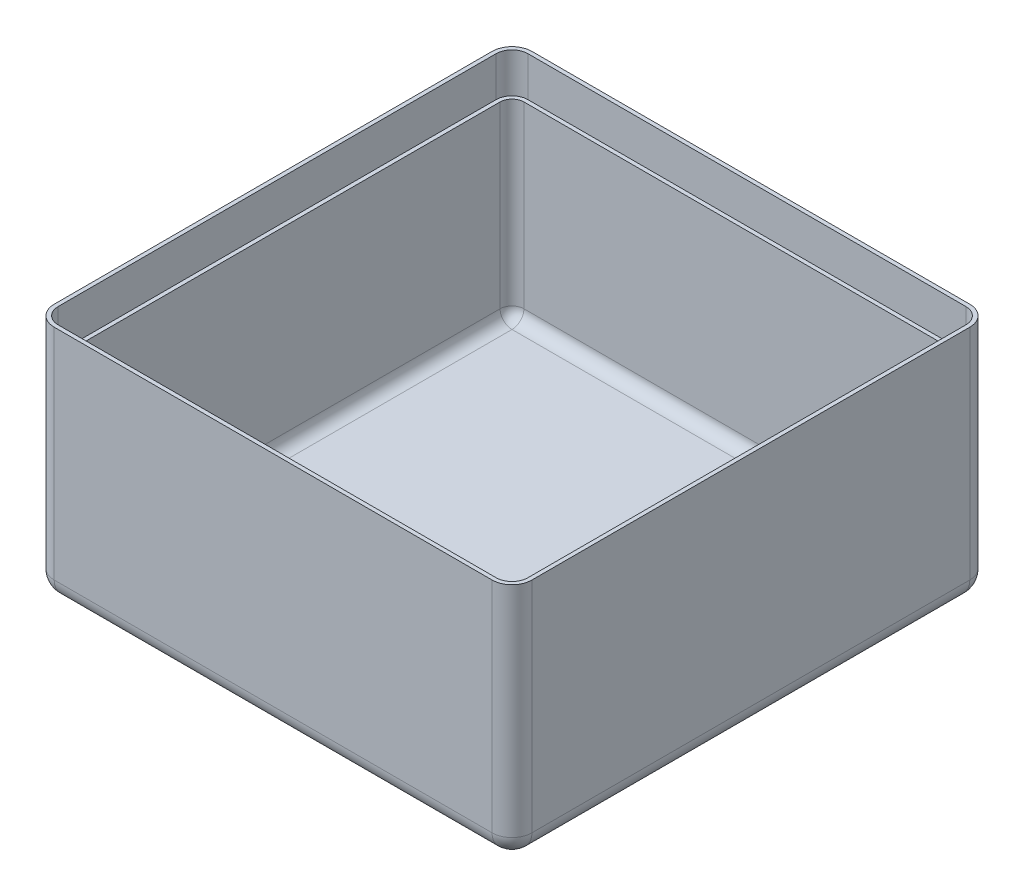
ISO-10303-21;
HEADER;
FILE_DESCRIPTION(('STEP AP214'),'2;1');
FILE_NAME('part.step','',(''),(''),'','','');
FILE_SCHEMA(('AUTOMOTIVE_DESIGN { 1 0 10303 214 1 1 1 1 }'));
ENDSEC;
DATA;
#1=APPLICATION_CONTEXT('core data for automotive mechanical design processes');
#2=APPLICATION_PROTOCOL_DEFINITION('international standard','automotive_design',2000,#1);
#3=PRODUCT_CONTEXT('',#1,'mechanical');
#4=PRODUCT('Part','Part','',(#3));
#5=PRODUCT_RELATED_PRODUCT_CATEGORY('part','',(#4));
#6=PRODUCT_DEFINITION_FORMATION('','',#4);
#7=PRODUCT_DEFINITION_CONTEXT('part definition',#1,'design');
#8=PRODUCT_DEFINITION('design','',#6,#7);
#9=PRODUCT_DEFINITION_SHAPE('','',#8);
#10=(LENGTH_UNIT() NAMED_UNIT(*) SI_UNIT(.MILLI.,.METRE.));
#11=(NAMED_UNIT(*) PLANE_ANGLE_UNIT() SI_UNIT($,.RADIAN.));
#12=(NAMED_UNIT(*) SI_UNIT($,.STERADIAN.) SOLID_ANGLE_UNIT());
#13=UNCERTAINTY_MEASURE_WITH_UNIT(LENGTH_MEASURE(1.E-05),#10,'distance_accuracy_value','');
#14=(GEOMETRIC_REPRESENTATION_CONTEXT(3) GLOBAL_UNCERTAINTY_ASSIGNED_CONTEXT((#13)) GLOBAL_UNIT_ASSIGNED_CONTEXT((#10,
#11,#12)) REPRESENTATION_CONTEXT('',''));
#15=CARTESIAN_POINT('',(0.,0.,0.));
#16=DIRECTION('',(0.,0.,1.));
#17=DIRECTION('',(1.,0.,0.));
#18=AXIS2_PLACEMENT_3D('',#15,#16,#17);
#19=CARTESIAN_POINT('',(0.,25.,0.));
#20=DIRECTION('',(0.,-1.,0.));
#21=DIRECTION('',(0.,0.,-1.));
#22=AXIS2_PLACEMENT_3D('',#19,#20,#21);
#23=PLANE('',#22);
#24=DIRECTION('',(0.,0.,-1.));
#25=VECTOR('',#24,1.);
#26=CARTESIAN_POINT('',(59.5,25.,-2.5));
#27=LINE('',#26,#25);
#28=CARTESIAN_POINT('',(59.5,25.,-2.5));
#29=VERTEX_POINT('',#28);
#30=CARTESIAN_POINT('',(59.5,25.,-57.5));
#31=VERTEX_POINT('',#30);
#32=EDGE_CURVE('E231',#29,#31,#27,.T.);
#33=ORIENTED_EDGE('',*,*,#32,.T.);
#34=CARTESIAN_POINT('',(57.5,25.,-57.5));
#35=DIRECTION('',(0.,1.,0.));
#36=DIRECTION('',(0.,0.,1.));
#37=AXIS2_PLACEMENT_3D('',#34,#35,#36);
#38=CIRCLE('',#37,2.);
#39=CARTESIAN_POINT('',(57.5,25.,-59.5));
#40=VERTEX_POINT('',#39);
#41=EDGE_CURVE('E259',#31,#40,#38,.T.);
#42=ORIENTED_EDGE('',*,*,#41,.T.);
#43=DIRECTION('',(-1.,0.,0.));
#44=VECTOR('',#43,1.);
#45=CARTESIAN_POINT('',(57.5,25.,-59.5));
#46=LINE('',#45,#44);
#47=CARTESIAN_POINT('',(2.49999999999998,25.,-59.5));
#48=VERTEX_POINT('',#47);
#49=EDGE_CURVE('E237',#40,#48,#46,.T.);
#50=ORIENTED_EDGE('',*,*,#49,.T.);
#51=CARTESIAN_POINT('',(2.49999999999998,25.,-57.5));
#52=DIRECTION('',(0.,1.,0.));
#53=DIRECTION('',(0.,0.,1.));
#54=AXIS2_PLACEMENT_3D('',#51,#52,#53);
#55=CIRCLE('',#54,2.);
#56=CARTESIAN_POINT('',(0.499999999999978,25.,-57.5));
#57=VERTEX_POINT('',#56);
#58=EDGE_CURVE('E262',#48,#57,#55,.T.);
#59=ORIENTED_EDGE('',*,*,#58,.T.);
#60=DIRECTION('',(0.,0.,1.));
#61=VECTOR('',#60,1.);
#62=CARTESIAN_POINT('',(0.499999999999979,25.,-57.5));
#63=LINE('',#62,#61);
#64=CARTESIAN_POINT('',(0.499999999999999,25.,-2.5));
#65=VERTEX_POINT('',#64);
#66=EDGE_CURVE('E265',#57,#65,#63,.T.);
#67=ORIENTED_EDGE('',*,*,#66,.T.);
#68=CARTESIAN_POINT('',(2.5,25.,-2.5));
#69=DIRECTION('',(0.,1.,0.));
#70=DIRECTION('',(0.,0.,1.));
#71=AXIS2_PLACEMENT_3D('',#68,#69,#70);
#72=CIRCLE('',#71,2.);
#73=CARTESIAN_POINT('',(2.5,25.,-0.5));
#74=VERTEX_POINT('',#73);
#75=EDGE_CURVE('E268',#65,#74,#72,.T.);
#76=ORIENTED_EDGE('',*,*,#75,.T.);
#77=DIRECTION('',(1.,0.,0.));
#78=VECTOR('',#77,1.);
#79=CARTESIAN_POINT('',(2.5,25.,-0.5));
#80=LINE('',#79,#78);
#81=CARTESIAN_POINT('',(57.5,25.,-0.5));
#82=VERTEX_POINT('',#81);
#83=EDGE_CURVE('E271',#74,#82,#80,.T.);
#84=ORIENTED_EDGE('',*,*,#83,.T.);
#85=CARTESIAN_POINT('',(57.5,25.,-2.5));
#86=DIRECTION('',(0.,1.,0.));
#87=DIRECTION('',(0.,0.,1.));
#88=AXIS2_PLACEMENT_3D('',#85,#86,#87);
#89=CIRCLE('',#88,2.);
#90=EDGE_CURVE('E274',#82,#29,#89,.T.);
#91=ORIENTED_EDGE('',*,*,#90,.T.);
#92=EDGE_LOOP('',(#33,#42,#50,#59,#67,#76,#84,#91));
#93=FACE_BOUND('',#92,.T.);
#94=DIRECTION('',(-1.,0.,0.));
#95=VECTOR('',#94,1.);
#96=CARTESIAN_POINT('',(0.,25.,-59.));
#97=LINE('',#96,#95);
#98=CARTESIAN_POINT('',(57.5,25.,-59.));
#99=VERTEX_POINT('',#98);
#100=CARTESIAN_POINT('',(2.49999999999998,25.,-59.));
#101=VERTEX_POINT('',#100);
#102=EDGE_CURVE('E373',#99,#101,#97,.T.);
#103=ORIENTED_EDGE('',*,*,#102,.F.);
#104=CARTESIAN_POINT('',(57.5,25.,-57.5));
#105=DIRECTION('',(0.,-1.,0.));
#106=DIRECTION('',(0.,0.,-1.));
#107=AXIS2_PLACEMENT_3D('',#104,#105,#106);
#108=CIRCLE('',#107,1.5);
#109=CARTESIAN_POINT('',(59.,25.,-57.5));
#110=VERTEX_POINT('',#109);
#111=EDGE_CURVE('E393',#110,#99,#108,.F.);
#112=ORIENTED_EDGE('',*,*,#111,.F.);
#113=DIRECTION('',(0.,0.,-1.));
#114=VECTOR('',#113,1.);
#115=CARTESIAN_POINT('',(59.,25.,0.));
#116=LINE('',#115,#114);
#117=CARTESIAN_POINT('',(59.,25.,-2.5));
#118=VERTEX_POINT('',#117);
#119=EDGE_CURVE('E58',#118,#110,#116,.T.);
#120=ORIENTED_EDGE('',*,*,#119,.F.);
#121=CARTESIAN_POINT('',(57.5,25.,-2.5));
#122=DIRECTION('',(0.,-1.,0.));
#123=DIRECTION('',(0.,0.,-1.));
#124=AXIS2_PLACEMENT_3D('',#121,#122,#123);
#125=CIRCLE('',#124,1.5);
#126=CARTESIAN_POINT('',(57.5,25.,-1.));
#127=VERTEX_POINT('',#126);
#128=EDGE_CURVE('E389',#127,#118,#125,.F.);
#129=ORIENTED_EDGE('',*,*,#128,.F.);
#130=DIRECTION('',(1.,0.,0.));
#131=VECTOR('',#130,1.);
#132=CARTESIAN_POINT('',(0.,25.,-1.));
#133=LINE('',#132,#131);
#134=CARTESIAN_POINT('',(2.5,25.,-1.));
#135=VERTEX_POINT('',#134);
#136=EDGE_CURVE('E387',#135,#127,#133,.T.);
#137=ORIENTED_EDGE('',*,*,#136,.F.);
#138=CARTESIAN_POINT('',(2.5,25.,-2.5));
#139=DIRECTION('',(0.,-1.,0.));
#140=DIRECTION('',(0.,0.,-1.));
#141=AXIS2_PLACEMENT_3D('',#138,#139,#140);
#142=CIRCLE('',#141,1.5);
#143=CARTESIAN_POINT('',(0.999999999999999,25.,-2.5));
#144=VERTEX_POINT('',#143);
#145=EDGE_CURVE('E317',#144,#135,#142,.F.);
#146=ORIENTED_EDGE('',*,*,#145,.F.);
#147=DIRECTION('',(0.,0.,1.));
#148=VECTOR('',#147,1.);
#149=CARTESIAN_POINT('',(1.,25.,0.));
#150=LINE('',#149,#148);
#151=CARTESIAN_POINT('',(0.99999999999998,25.,-57.5));
#152=VERTEX_POINT('',#151);
#153=EDGE_CURVE('E361',#152,#144,#150,.T.);
#154=ORIENTED_EDGE('',*,*,#153,.F.);
#155=CARTESIAN_POINT('',(2.49999999999998,25.,-57.5));
#156=DIRECTION('',(0.,-1.,0.));
#157=DIRECTION('',(0.,0.,-1.));
#158=AXIS2_PLACEMENT_3D('',#155,#156,#157);
#159=CIRCLE('',#158,1.5);
#160=EDGE_CURVE('E396',#101,#152,#159,.F.);
#161=ORIENTED_EDGE('',*,*,#160,.F.);
#162=EDGE_LOOP('',(#103,#112,#120,#129,#137,#146,#154,#161));
#163=FACE_BOUND('',#162,.T.);
#164=ADVANCED_FACE('F33',(#93,#163),#23,.F.);
#165=CARTESIAN_POINT('',(1.,25.,0.));
#166=DIRECTION('',(1.,0.,0.));
#167=DIRECTION('',(0.,0.,-1.));
#168=AXIS2_PLACEMENT_3D('',#165,#166,#167);
#169=PLANE('',#168);
#170=ORIENTED_EDGE('',*,*,#153,.T.);
#171=DIRECTION('',(0.,1.,0.));
#172=VECTOR('',#171,1.);
#173=CARTESIAN_POINT('',(0.999999999999999,25.,-2.5));
#174=LINE('',#173,#172);
#175=CARTESIAN_POINT('',(0.999999999999999,2.5,-2.5));
#176=VERTEX_POINT('',#175);
#177=EDGE_CURVE('E320',#176,#144,#174,.T.);
#178=ORIENTED_EDGE('',*,*,#177,.F.);
#179=DIRECTION('',(0.,0.,-1.));
#180=VECTOR('',#179,1.);
#181=CARTESIAN_POINT('',(1.,2.5,0.));
#182=LINE('',#181,#180);
#183=CARTESIAN_POINT('',(0.99999999999998,2.5,-57.5));
#184=VERTEX_POINT('',#183);
#185=EDGE_CURVE('E318',#184,#176,#182,.F.);
#186=ORIENTED_EDGE('',*,*,#185,.F.);
#187=DIRECTION('',(0.,1.,0.));
#188=VECTOR('',#187,1.);
#189=CARTESIAN_POINT('',(0.99999999999998,25.,-57.5));
#190=LINE('',#189,#188);
#191=EDGE_CURVE('E315',#152,#184,#190,.F.);
#192=ORIENTED_EDGE('',*,*,#191,.F.);
#193=EDGE_LOOP('',(#170,#178,#186,#192));
#194=FACE_BOUND('',#193,.T.);
#195=ADVANCED_FACE('F527',(#194),#169,.T.);
#196=CARTESIAN_POINT('',(0.,25.,-1.));
#197=DIRECTION('',(0.,0.,-1.));
#198=DIRECTION('',(-1.,0.,0.));
#199=AXIS2_PLACEMENT_3D('',#196,#197,#198);
#200=PLANE('',#199);
#201=DIRECTION('',(-1.,0.,0.));
#202=VECTOR('',#201,1.);
#203=CARTESIAN_POINT('',(0.,2.5,-1.));
#204=LINE('',#203,#202);
#205=CARTESIAN_POINT('',(2.5,2.5,-1.));
#206=VERTEX_POINT('',#205);
#207=CARTESIAN_POINT('',(57.5,2.5,-1.));
#208=VERTEX_POINT('',#207);
#209=EDGE_CURVE('E372',#206,#208,#204,.F.);
#210=ORIENTED_EDGE('',*,*,#209,.F.);
#211=DIRECTION('',(0.,1.,0.));
#212=VECTOR('',#211,1.);
#213=CARTESIAN_POINT('',(2.5,25.,-1.));
#214=LINE('',#213,#212);
#215=EDGE_CURVE('E370',#135,#206,#214,.F.);
#216=ORIENTED_EDGE('',*,*,#215,.F.);
#217=ORIENTED_EDGE('',*,*,#136,.T.);
#218=DIRECTION('',(0.,1.,0.));
#219=VECTOR('',#218,1.);
#220=CARTESIAN_POINT('',(57.5,25.,-1.));
#221=LINE('',#220,#219);
#222=EDGE_CURVE('E357',#208,#127,#221,.T.);
#223=ORIENTED_EDGE('',*,*,#222,.F.);
#224=EDGE_LOOP('',(#210,#216,#217,#223));
#225=FACE_BOUND('',#224,.T.);
#226=ADVANCED_FACE('F535',(#225),#200,.T.);
#227=CARTESIAN_POINT('',(59.,25.,0.));
#228=DIRECTION('',(-1.,0.,0.));
#229=DIRECTION('',(0.,0.,1.));
#230=AXIS2_PLACEMENT_3D('',#227,#228,#229);
#231=PLANE('',#230);
#232=DIRECTION('',(0.,0.,1.));
#233=VECTOR('',#232,1.);
#234=CARTESIAN_POINT('',(59.,2.5,0.));
#235=LINE('',#234,#233);
#236=CARTESIAN_POINT('',(59.,2.5,-2.5));
#237=VERTEX_POINT('',#236);
#238=CARTESIAN_POINT('',(59.,2.5,-57.5));
#239=VERTEX_POINT('',#238);
#240=EDGE_CURVE('E335',#237,#239,#235,.F.);
#241=ORIENTED_EDGE('',*,*,#240,.F.);
#242=DIRECTION('',(0.,1.,0.));
#243=VECTOR('',#242,1.);
#244=CARTESIAN_POINT('',(59.,25.,-2.5));
#245=LINE('',#244,#243);
#246=EDGE_CURVE('E340',#118,#237,#245,.F.);
#247=ORIENTED_EDGE('',*,*,#246,.F.);
#248=ORIENTED_EDGE('',*,*,#119,.T.);
#249=DIRECTION('',(0.,1.,0.));
#250=VECTOR('',#249,1.);
#251=CARTESIAN_POINT('',(59.,25.,-57.5));
#252=LINE('',#251,#250);
#253=EDGE_CURVE('E333',#239,#110,#252,.T.);
#254=ORIENTED_EDGE('',*,*,#253,.F.);
#255=EDGE_LOOP('',(#241,#247,#248,#254));
#256=FACE_BOUND('',#255,.T.);
#257=ADVANCED_FACE('F619',(#256),#231,.T.);
#258=CARTESIAN_POINT('',(0.,25.,-59.));
#259=DIRECTION('',(0.,0.,1.));
#260=DIRECTION('',(1.,0.,0.));
#261=AXIS2_PLACEMENT_3D('',#258,#259,#260);
#262=PLANE('',#261);
#263=DIRECTION('',(1.,0.,0.));
#264=VECTOR('',#263,1.);
#265=CARTESIAN_POINT('',(0.,2.5,-59.));
#266=LINE('',#265,#264);
#267=CARTESIAN_POINT('',(57.5,2.5,-59.));
#268=VERTEX_POINT('',#267);
#269=CARTESIAN_POINT('',(2.49999999999998,2.5,-59.));
#270=VERTEX_POINT('',#269);
#271=EDGE_CURVE('E324',#268,#270,#266,.F.);
#272=ORIENTED_EDGE('',*,*,#271,.F.);
#273=DIRECTION('',(0.,1.,0.));
#274=VECTOR('',#273,1.);
#275=CARTESIAN_POINT('',(57.5,25.,-59.));
#276=LINE('',#275,#274);
#277=EDGE_CURVE('E331',#99,#268,#276,.F.);
#278=ORIENTED_EDGE('',*,*,#277,.F.);
#279=ORIENTED_EDGE('',*,*,#102,.T.);
#280=DIRECTION('',(0.,1.,0.));
#281=VECTOR('',#280,1.);
#282=CARTESIAN_POINT('',(2.49999999999998,25.,-59.));
#283=LINE('',#282,#281);
#284=EDGE_CURVE('E322',#270,#101,#283,.T.);
#285=ORIENTED_EDGE('',*,*,#284,.F.);
#286=EDGE_LOOP('',(#272,#278,#279,#285));
#287=FACE_BOUND('',#286,.T.);
#288=ADVANCED_FACE('F627',(#287),#262,.T.);
#289=CARTESIAN_POINT('',(0.,1.,0.));
#290=DIRECTION('',(0.,-1.,0.));
#291=DIRECTION('',(0.,0.,-1.));
#292=AXIS2_PLACEMENT_3D('',#289,#290,#291);
#293=PLANE('',#292);
#294=DIRECTION('',(0.,0.,-1.));
#295=VECTOR('',#294,1.);
#296=CARTESIAN_POINT('',(57.5,1.,0.));
#297=LINE('',#296,#295);
#298=CARTESIAN_POINT('',(57.5,1.,-57.5));
#299=VERTEX_POINT('',#298);
#300=CARTESIAN_POINT('',(57.5,1.,-2.5));
#301=VERTEX_POINT('',#300);
#302=EDGE_CURVE('E350',#299,#301,#297,.F.);
#303=ORIENTED_EDGE('',*,*,#302,.F.);
#304=DIRECTION('',(1.,0.,0.));
#305=VECTOR('',#304,1.);
#306=CARTESIAN_POINT('',(0.,1.,-57.5));
#307=LINE('',#306,#305);
#308=CARTESIAN_POINT('',(2.49999999999998,1.,-57.5));
#309=VERTEX_POINT('',#308);
#310=EDGE_CURVE('E352',#309,#299,#307,.T.);
#311=ORIENTED_EDGE('',*,*,#310,.F.);
#312=DIRECTION('',(0.,0.,-1.));
#313=VECTOR('',#312,1.);
#314=CARTESIAN_POINT('',(2.5,1.,0.));
#315=LINE('',#314,#313);
#316=CARTESIAN_POINT('',(2.5,0.999999999999999,-2.5));
#317=VERTEX_POINT('',#316);
#318=EDGE_CURVE('E355',#317,#309,#315,.T.);
#319=ORIENTED_EDGE('',*,*,#318,.F.);
#320=DIRECTION('',(1.,0.,0.));
#321=VECTOR('',#320,1.);
#322=CARTESIAN_POINT('',(0.,1.,-2.5));
#323=LINE('',#322,#321);
#324=EDGE_CURVE('E342',#301,#317,#323,.F.);
#325=ORIENTED_EDGE('',*,*,#324,.F.);
#326=EDGE_LOOP('',(#303,#311,#319,#325));
#327=FACE_BOUND('',#326,.T.);
#328=ADVANCED_FACE('F634',(#327),#293,.F.);
#329=CARTESIAN_POINT('',(2.49999999999998,25.,-57.5));
#330=DIRECTION('',(0.,-1.,0.));
#331=DIRECTION('',(0.,0.,-1.));
#332=AXIS2_PLACEMENT_3D('',#329,#330,#331);
#333=CYLINDRICAL_SURFACE('',#332,1.5);
#334=ORIENTED_EDGE('',*,*,#160,.T.);
#335=ORIENTED_EDGE('',*,*,#191,.T.);
#336=CARTESIAN_POINT('',(2.49999999999998,2.5,-57.5));
#337=DIRECTION('',(0.,1.,0.));
#338=DIRECTION('',(-1.,0.,0.));
#339=AXIS2_PLACEMENT_3D('',#336,#337,#338);
#340=CIRCLE('',#339,1.5);
#341=EDGE_CURVE('E325',#184,#270,#340,.F.);
#342=ORIENTED_EDGE('',*,*,#341,.T.);
#343=ORIENTED_EDGE('',*,*,#284,.T.);
#344=EDGE_LOOP('',(#334,#335,#342,#343));
#345=FACE_BOUND('',#344,.T.);
#346=ADVANCED_FACE('F642',(#345),#333,.F.);
#347=CARTESIAN_POINT('',(57.5,25.,-57.5));
#348=DIRECTION('',(0.,-1.,0.));
#349=DIRECTION('',(0.,0.,-1.));
#350=AXIS2_PLACEMENT_3D('',#347,#348,#349);
#351=CYLINDRICAL_SURFACE('',#350,1.5);
#352=ORIENTED_EDGE('',*,*,#111,.T.);
#353=ORIENTED_EDGE('',*,*,#277,.T.);
#354=CARTESIAN_POINT('',(57.5,2.5,-57.5));
#355=DIRECTION('',(0.,-1.,0.));
#356=DIRECTION('',(1.,0.,0.));
#357=AXIS2_PLACEMENT_3D('',#354,#355,#356);
#358=CIRCLE('',#357,1.5);
#359=EDGE_CURVE('E329',#268,#239,#358,.T.);
#360=ORIENTED_EDGE('',*,*,#359,.T.);
#361=ORIENTED_EDGE('',*,*,#253,.T.);
#362=EDGE_LOOP('',(#352,#353,#360,#361));
#363=FACE_BOUND('',#362,.T.);
#364=ADVANCED_FACE('F650',(#363),#351,.F.);
#365=CARTESIAN_POINT('',(0.,2.5,-57.5));
#366=DIRECTION('',(1.,0.,0.));
#367=DIRECTION('',(0.,0.,-1.));
#368=AXIS2_PLACEMENT_3D('',#365,#366,#367);
#369=CYLINDRICAL_SURFACE('',#368,1.5);
#370=CARTESIAN_POINT('',(2.49999999999998,2.5,-57.5));
#371=DIRECTION('',(-1.,0.,0.));
#372=DIRECTION('',(0.,-1.,0.));
#373=AXIS2_PLACEMENT_3D('',#370,#371,#372);
#374=CIRCLE('',#373,1.5);
#375=EDGE_CURVE('E328',#270,#309,#374,.T.);
#376=ORIENTED_EDGE('',*,*,#375,.T.);
#377=ORIENTED_EDGE('',*,*,#310,.T.);
#378=CARTESIAN_POINT('',(57.5,2.5,-57.5));
#379=DIRECTION('',(-1.,0.,0.));
#380=DIRECTION('',(0.,-1.,0.));
#381=AXIS2_PLACEMENT_3D('',#378,#379,#380);
#382=CIRCLE('',#381,1.5);
#383=EDGE_CURVE('E338',#299,#268,#382,.F.);
#384=ORIENTED_EDGE('',*,*,#383,.T.);
#385=ORIENTED_EDGE('',*,*,#271,.T.);
#386=EDGE_LOOP('',(#376,#377,#384,#385));
#387=FACE_BOUND('',#386,.T.);
#388=ADVANCED_FACE('F658',(#387),#369,.F.);
#389=CARTESIAN_POINT('',(2.49999999999998,2.5,-57.5));
#390=DIRECTION('',(0.,0.,1.));
#391=DIRECTION('',(1.,0.,0.));
#392=AXIS2_PLACEMENT_3D('',#389,#390,#391);
#393=SPHERICAL_SURFACE('',#392,1.5);
#394=ORIENTED_EDGE('',*,*,#341,.F.);
#395=CARTESIAN_POINT('',(2.49999999999998,2.5,-57.5));
#396=DIRECTION('',(0.,0.,-1.));
#397=DIRECTION('',(-1.,0.,0.));
#398=AXIS2_PLACEMENT_3D('',#395,#396,#397);
#399=CIRCLE('',#398,1.5);
#400=EDGE_CURVE('E345',#184,#309,#399,.F.);
#401=ORIENTED_EDGE('',*,*,#400,.T.);
#402=ORIENTED_EDGE('',*,*,#375,.F.);
#403=EDGE_LOOP('',(#394,#401,#402));
#404=FACE_BOUND('',#403,.T.);
#405=ADVANCED_FACE('F666',(#404),#393,.F.);
#406=CARTESIAN_POINT('',(57.5,2.5,-57.5));
#407=DIRECTION('',(0.,0.,1.));
#408=DIRECTION('',(1.,0.,0.));
#409=AXIS2_PLACEMENT_3D('',#406,#407,#408);
#410=SPHERICAL_SURFACE('',#409,1.5);
#411=ORIENTED_EDGE('',*,*,#383,.F.);
#412=CARTESIAN_POINT('',(57.5,2.5,-57.5));
#413=DIRECTION('',(0.,0.,1.));
#414=DIRECTION('',(1.,0.,0.));
#415=AXIS2_PLACEMENT_3D('',#412,#413,#414);
#416=CIRCLE('',#415,1.5);
#417=EDGE_CURVE('E346',#299,#239,#416,.T.);
#418=ORIENTED_EDGE('',*,*,#417,.T.);
#419=ORIENTED_EDGE('',*,*,#359,.F.);
#420=EDGE_LOOP('',(#411,#418,#419));
#421=FACE_BOUND('',#420,.T.);
#422=ADVANCED_FACE('F674',(#421),#410,.F.);
#423=CARTESIAN_POINT('',(2.5,2.5,0.));
#424=DIRECTION('',(0.,0.,-1.));
#425=DIRECTION('',(-1.,0.,0.));
#426=AXIS2_PLACEMENT_3D('',#423,#424,#425);
#427=CYLINDRICAL_SURFACE('',#426,1.5);
#428=ORIENTED_EDGE('',*,*,#400,.F.);
#429=ORIENTED_EDGE('',*,*,#185,.T.);
#430=CARTESIAN_POINT('',(2.5,2.5,-2.5));
#431=DIRECTION('',(0.,0.,1.));
#432=DIRECTION('',(1.,0.,0.));
#433=AXIS2_PLACEMENT_3D('',#430,#431,#432);
#434=CIRCLE('',#433,1.5);
#435=EDGE_CURVE('E349',#176,#317,#434,.T.);
#436=ORIENTED_EDGE('',*,*,#435,.T.);
#437=ORIENTED_EDGE('',*,*,#318,.T.);
#438=EDGE_LOOP('',(#428,#429,#436,#437));
#439=FACE_BOUND('',#438,.T.);
#440=ADVANCED_FACE('F682',(#439),#427,.F.);
#441=CARTESIAN_POINT('',(2.5,25.,-2.5));
#442=DIRECTION('',(0.,-1.,0.));
#443=DIRECTION('',(0.,0.,-1.));
#444=AXIS2_PLACEMENT_3D('',#441,#442,#443);
#445=CYLINDRICAL_SURFACE('',#444,1.5);
#446=ORIENTED_EDGE('',*,*,#145,.T.);
#447=ORIENTED_EDGE('',*,*,#215,.T.);
#448=CARTESIAN_POINT('',(2.5,2.5,-2.5));
#449=DIRECTION('',(0.,1.,0.));
#450=DIRECTION('',(-1.,0.,0.));
#451=AXIS2_PLACEMENT_3D('',#448,#449,#450);
#452=CIRCLE('',#451,1.5);
#453=EDGE_CURVE('E366',#206,#176,#452,.F.);
#454=ORIENTED_EDGE('',*,*,#453,.T.);
#455=ORIENTED_EDGE('',*,*,#177,.T.);
#456=EDGE_LOOP('',(#446,#447,#454,#455));
#457=FACE_BOUND('',#456,.T.);
#458=ADVANCED_FACE('F690',(#457),#445,.F.);
#459=CARTESIAN_POINT('',(57.5,25.,-2.5));
#460=DIRECTION('',(0.,-1.,0.));
#461=DIRECTION('',(0.,0.,-1.));
#462=AXIS2_PLACEMENT_3D('',#459,#460,#461);
#463=CYLINDRICAL_SURFACE('',#462,1.5);
#464=ORIENTED_EDGE('',*,*,#128,.T.);
#465=ORIENTED_EDGE('',*,*,#246,.T.);
#466=CARTESIAN_POINT('',(57.5,2.5,-2.5));
#467=DIRECTION('',(0.,-1.,0.));
#468=DIRECTION('',(1.,0.,0.));
#469=AXIS2_PLACEMENT_3D('',#466,#467,#468);
#470=CIRCLE('',#469,1.5);
#471=EDGE_CURVE('E369',#237,#208,#470,.T.);
#472=ORIENTED_EDGE('',*,*,#471,.T.);
#473=ORIENTED_EDGE('',*,*,#222,.T.);
#474=EDGE_LOOP('',(#464,#465,#472,#473));
#475=FACE_BOUND('',#474,.T.);
#476=ADVANCED_FACE('F698',(#475),#463,.F.);
#477=CARTESIAN_POINT('',(57.5,2.5,0.));
#478=DIRECTION('',(0.,0.,1.));
#479=DIRECTION('',(1.,0.,0.));
#480=AXIS2_PLACEMENT_3D('',#477,#478,#479);
#481=CYLINDRICAL_SURFACE('',#480,1.5);
#482=ORIENTED_EDGE('',*,*,#417,.F.);
#483=ORIENTED_EDGE('',*,*,#302,.T.);
#484=CARTESIAN_POINT('',(57.5,2.5,-2.5));
#485=DIRECTION('',(0.,0.,1.));
#486=DIRECTION('',(1.,0.,0.));
#487=AXIS2_PLACEMENT_3D('',#484,#485,#486);
#488=CIRCLE('',#487,1.5);
#489=EDGE_CURVE('E379',#301,#237,#488,.T.);
#490=ORIENTED_EDGE('',*,*,#489,.T.);
#491=ORIENTED_EDGE('',*,*,#240,.T.);
#492=EDGE_LOOP('',(#482,#483,#490,#491));
#493=FACE_BOUND('',#492,.T.);
#494=ADVANCED_FACE('F706',(#493),#481,.F.);
#495=CARTESIAN_POINT('',(2.5,2.5,-2.5));
#496=DIRECTION('',(0.,0.,1.));
#497=DIRECTION('',(1.,0.,0.));
#498=AXIS2_PLACEMENT_3D('',#495,#496,#497);
#499=SPHERICAL_SURFACE('',#498,1.5);
#500=ORIENTED_EDGE('',*,*,#453,.F.);
#501=CARTESIAN_POINT('',(2.5,2.5,-2.5));
#502=DIRECTION('',(-1.,0.,0.));
#503=DIRECTION('',(0.,0.,1.));
#504=AXIS2_PLACEMENT_3D('',#501,#502,#503);
#505=CIRCLE('',#504,1.5);
#506=EDGE_CURVE('E382',#206,#317,#505,.F.);
#507=ORIENTED_EDGE('',*,*,#506,.T.);
#508=ORIENTED_EDGE('',*,*,#435,.F.);
#509=EDGE_LOOP('',(#500,#507,#508));
#510=FACE_BOUND('',#509,.T.);
#511=ADVANCED_FACE('F714',(#510),#499,.F.);
#512=CARTESIAN_POINT('',(57.5,2.5,-2.5));
#513=DIRECTION('',(0.,0.,1.));
#514=DIRECTION('',(1.,0.,0.));
#515=AXIS2_PLACEMENT_3D('',#512,#513,#514);
#516=SPHERICAL_SURFACE('',#515,1.5);
#517=ORIENTED_EDGE('',*,*,#489,.F.);
#518=CARTESIAN_POINT('',(57.5,2.5,-2.5));
#519=DIRECTION('',(-1.,0.,0.));
#520=DIRECTION('',(0.,0.,1.));
#521=AXIS2_PLACEMENT_3D('',#518,#519,#520);
#522=CIRCLE('',#521,1.5);
#523=EDGE_CURVE('E314',#301,#208,#522,.T.);
#524=ORIENTED_EDGE('',*,*,#523,.T.);
#525=ORIENTED_EDGE('',*,*,#471,.F.);
#526=EDGE_LOOP('',(#517,#524,#525));
#527=FACE_BOUND('',#526,.T.);
#528=ADVANCED_FACE('F722',(#527),#516,.F.);
#529=CARTESIAN_POINT('',(0.,2.5,-2.5));
#530=DIRECTION('',(-1.,0.,0.));
#531=DIRECTION('',(0.,0.,1.));
#532=AXIS2_PLACEMENT_3D('',#529,#530,#531);
#533=CYLINDRICAL_SURFACE('',#532,1.5);
#534=ORIENTED_EDGE('',*,*,#506,.F.);
#535=ORIENTED_EDGE('',*,*,#209,.T.);
#536=ORIENTED_EDGE('',*,*,#523,.F.);
#537=ORIENTED_EDGE('',*,*,#324,.T.);
#538=EDGE_LOOP('',(#534,#535,#536,#537));
#539=FACE_BOUND('',#538,.T.);
#540=ADVANCED_FACE('F541',(#539),#533,.F.);
#541=CARTESIAN_POINT('',(57.5,30.,-57.5));
#542=DIRECTION('',(0.,1.,0.));
#543=DIRECTION('',(0.,0.,1.));
#544=AXIS2_PLACEMENT_3D('',#541,#542,#543);
#545=PLANE('',#544);
#546=CARTESIAN_POINT('',(57.5,30.,-57.5));
#547=DIRECTION('',(0.,1.,0.));
#548=DIRECTION('',(0.,0.,1.));
#549=AXIS2_PLACEMENT_3D('',#546,#547,#548);
#550=CIRCLE('',#549,2.5);
#551=CARTESIAN_POINT('',(60.,30.,-57.5));
#552=VERTEX_POINT('',#551);
#553=CARTESIAN_POINT('',(57.5,30.,-60.));
#554=VERTEX_POINT('',#553);
#555=EDGE_CURVE('E238',#552,#554,#550,.T.);
#556=ORIENTED_EDGE('',*,*,#555,.T.);
#557=DIRECTION('',(-1.,0.,0.));
#558=VECTOR('',#557,1.);
#559=CARTESIAN_POINT('',(57.5,30.,-60.));
#560=LINE('',#559,#558);
#561=CARTESIAN_POINT('',(2.49999999999998,30.,-60.));
#562=VERTEX_POINT('',#561);
#563=EDGE_CURVE('E293',#554,#562,#560,.T.);
#564=ORIENTED_EDGE('',*,*,#563,.T.);
#565=CARTESIAN_POINT('',(2.49999999999998,30.,-57.5));
#566=DIRECTION('',(0.,1.,0.));
#567=DIRECTION('',(0.,0.,1.));
#568=AXIS2_PLACEMENT_3D('',#565,#566,#567);
#569=CIRCLE('',#568,2.5);
#570=CARTESIAN_POINT('',(0.,30.,-57.5));
#571=VERTEX_POINT('',#570);
#572=EDGE_CURVE('E296',#562,#571,#569,.T.);
#573=ORIENTED_EDGE('',*,*,#572,.T.);
#574=DIRECTION('',(0.,0.,1.));
#575=VECTOR('',#574,1.);
#576=CARTESIAN_POINT('',(0.,30.,-57.5));
#577=LINE('',#576,#575);
#578=CARTESIAN_POINT('',(0.,30.,-2.5));
#579=VERTEX_POINT('',#578);
#580=EDGE_CURVE('E299',#571,#579,#577,.T.);
#581=ORIENTED_EDGE('',*,*,#580,.T.);
#582=CARTESIAN_POINT('',(2.5,30.,-2.5));
#583=DIRECTION('',(0.,1.,0.));
#584=DIRECTION('',(0.,0.,1.));
#585=AXIS2_PLACEMENT_3D('',#582,#583,#584);
#586=CIRCLE('',#585,2.5);
#587=CARTESIAN_POINT('',(2.5,30.,0.));
#588=VERTEX_POINT('',#587);
#589=EDGE_CURVE('E302',#579,#588,#586,.T.);
#590=ORIENTED_EDGE('',*,*,#589,.T.);
#591=DIRECTION('',(1.,0.,0.));
#592=VECTOR('',#591,1.);
#593=CARTESIAN_POINT('',(2.5,30.,0.));
#594=LINE('',#593,#592);
#595=CARTESIAN_POINT('',(57.5,30.,0.));
#596=VERTEX_POINT('',#595);
#597=EDGE_CURVE('E305',#588,#596,#594,.T.);
#598=ORIENTED_EDGE('',*,*,#597,.T.);
#599=CARTESIAN_POINT('',(57.5,30.,-2.5));
#600=DIRECTION('',(0.,1.,0.));
#601=DIRECTION('',(0.,0.,1.));
#602=AXIS2_PLACEMENT_3D('',#599,#600,#601);
#603=CIRCLE('',#602,2.5);
#604=CARTESIAN_POINT('',(60.,30.,-2.5));
#605=VERTEX_POINT('',#604);
#606=EDGE_CURVE('E308',#596,#605,#603,.T.);
#607=ORIENTED_EDGE('',*,*,#606,.T.);
#608=DIRECTION('',(0.,0.,-1.));
#609=VECTOR('',#608,1.);
#610=CARTESIAN_POINT('',(60.,30.,-2.5));
#611=LINE('',#610,#609);
#612=EDGE_CURVE('E311',#605,#552,#611,.T.);
#613=ORIENTED_EDGE('',*,*,#612,.T.);
#614=EDGE_LOOP('',(#556,#564,#573,#581,#590,#598,#607,#613));
#615=FACE_BOUND('',#614,.T.);
#616=DIRECTION('',(-1.,0.,0.));
#617=VECTOR('',#616,1.);
#618=CARTESIAN_POINT('',(57.5,30.,-59.5));
#619=LINE('',#618,#617);
#620=CARTESIAN_POINT('',(57.5,30.,-59.5));
#621=VERTEX_POINT('',#620);
#622=CARTESIAN_POINT('',(2.49999999999998,30.,-59.5));
#623=VERTEX_POINT('',#622);
#624=EDGE_CURVE('E230',#621,#623,#619,.T.);
#625=ORIENTED_EDGE('',*,*,#624,.F.);
#626=CARTESIAN_POINT('',(57.5,30.,-57.5));
#627=DIRECTION('',(0.,1.,0.));
#628=DIRECTION('',(0.,0.,1.));
#629=AXIS2_PLACEMENT_3D('',#626,#627,#628);
#630=CIRCLE('',#629,2.);
#631=CARTESIAN_POINT('',(59.5,30.,-57.5));
#632=VERTEX_POINT('',#631);
#633=EDGE_CURVE('E222',#632,#621,#630,.T.);
#634=ORIENTED_EDGE('',*,*,#633,.F.);
#635=DIRECTION('',(0.,0.,-1.));
#636=VECTOR('',#635,1.);
#637=CARTESIAN_POINT('',(59.5,30.,-2.5));
#638=LINE('',#637,#636);
#639=CARTESIAN_POINT('',(59.5,30.,-2.5));
#640=VERTEX_POINT('',#639);
#641=EDGE_CURVE('E257',#640,#632,#638,.T.);
#642=ORIENTED_EDGE('',*,*,#641,.F.);
#643=CARTESIAN_POINT('',(57.5,30.,-2.5));
#644=DIRECTION('',(0.,1.,0.));
#645=DIRECTION('',(0.,0.,1.));
#646=AXIS2_PLACEMENT_3D('',#643,#644,#645);
#647=CIRCLE('',#646,2.);
#648=CARTESIAN_POINT('',(57.5,30.,-0.5));
#649=VERTEX_POINT('',#648);
#650=EDGE_CURVE('E254',#649,#640,#647,.T.);
#651=ORIENTED_EDGE('',*,*,#650,.F.);
#652=DIRECTION('',(1.,0.,0.));
#653=VECTOR('',#652,1.);
#654=CARTESIAN_POINT('',(2.5,30.,-0.5));
#655=LINE('',#654,#653);
#656=CARTESIAN_POINT('',(2.5,30.,-0.5));
#657=VERTEX_POINT('',#656);
#658=EDGE_CURVE('E252',#657,#649,#655,.T.);
#659=ORIENTED_EDGE('',*,*,#658,.F.);
#660=CARTESIAN_POINT('',(2.5,30.,-2.5));
#661=DIRECTION('',(0.,1.,0.));
#662=DIRECTION('',(0.,0.,1.));
#663=AXIS2_PLACEMENT_3D('',#660,#661,#662);
#664=CIRCLE('',#663,2.);
#665=CARTESIAN_POINT('',(0.499999999999999,30.,-2.5));
#666=VERTEX_POINT('',#665);
#667=EDGE_CURVE('E250',#666,#657,#664,.T.);
#668=ORIENTED_EDGE('',*,*,#667,.F.);
#669=DIRECTION('',(0.,0.,1.));
#670=VECTOR('',#669,1.);
#671=CARTESIAN_POINT('',(0.499999999999979,30.,-57.5));
#672=LINE('',#671,#670);
#673=CARTESIAN_POINT('',(0.499999999999978,30.,-57.5));
#674=VERTEX_POINT('',#673);
#675=EDGE_CURVE('E246',#674,#666,#672,.T.);
#676=ORIENTED_EDGE('',*,*,#675,.F.);
#677=CARTESIAN_POINT('',(2.49999999999998,30.,-57.5));
#678=DIRECTION('',(0.,1.,0.));
#679=DIRECTION('',(0.,0.,1.));
#680=AXIS2_PLACEMENT_3D('',#677,#678,#679);
#681=CIRCLE('',#680,2.);
#682=EDGE_CURVE('E244',#623,#674,#681,.T.);
#683=ORIENTED_EDGE('',*,*,#682,.F.);
#684=EDGE_LOOP('',(#625,#634,#642,#651,#659,#668,#676,#683));
#685=FACE_BOUND('',#684,.T.);
#686=ADVANCED_FACE('F242',(#615,#685),#545,.T.);
#687=CARTESIAN_POINT('',(57.5,30.,-57.5));
#688=DIRECTION('',(0.,-1.,0.));
#689=DIRECTION('',(0.,0.,-1.));
#690=AXIS2_PLACEMENT_3D('',#687,#688,#689);
#691=CYLINDRICAL_SURFACE('',#690,2.);
#692=ORIENTED_EDGE('',*,*,#41,.F.);
#693=DIRECTION('',(0.,-1.,0.));
#694=VECTOR('',#693,1.);
#695=CARTESIAN_POINT('',(59.5,30.,-57.5));
#696=LINE('',#695,#694);
#697=EDGE_CURVE('E50',#632,#31,#696,.T.);
#698=ORIENTED_EDGE('',*,*,#697,.F.);
#699=ORIENTED_EDGE('',*,*,#633,.T.);
#700=DIRECTION('',(0.,-1.,0.));
#701=VECTOR('',#700,1.);
#702=CARTESIAN_POINT('',(57.5,30.,-59.5));
#703=LINE('',#702,#701);
#704=EDGE_CURVE('E225',#621,#40,#703,.T.);
#705=ORIENTED_EDGE('',*,*,#704,.T.);
#706=EDGE_LOOP('',(#692,#698,#699,#705));
#707=FACE_BOUND('',#706,.T.);
#708=ADVANCED_FACE('F224',(#707),#691,.F.);
#709=CARTESIAN_POINT('',(57.5,30.,-59.5));
#710=DIRECTION('',(0.,0.,1.));
#711=DIRECTION('',(1.,0.,0.));
#712=AXIS2_PLACEMENT_3D('',#709,#710,#711);
#713=PLANE('',#712);
#714=ORIENTED_EDGE('',*,*,#49,.F.);
#715=ORIENTED_EDGE('',*,*,#704,.F.);
#716=ORIENTED_EDGE('',*,*,#624,.T.);
#717=DIRECTION('',(0.,-1.,0.));
#718=VECTOR('',#717,1.);
#719=CARTESIAN_POINT('',(2.49999999999998,30.,-59.5));
#720=LINE('',#719,#718);
#721=EDGE_CURVE('E239',#623,#48,#720,.T.);
#722=ORIENTED_EDGE('',*,*,#721,.T.);
#723=EDGE_LOOP('',(#714,#715,#716,#722));
#724=FACE_BOUND('',#723,.T.);
#725=ADVANCED_FACE('F234',(#724),#713,.T.);
#726=CARTESIAN_POINT('',(2.49999999999998,30.,-57.5));
#727=DIRECTION('',(0.,-1.,0.));
#728=DIRECTION('',(0.,0.,-1.));
#729=AXIS2_PLACEMENT_3D('',#726,#727,#728);
#730=CYLINDRICAL_SURFACE('',#729,2.);
#731=ORIENTED_EDGE('',*,*,#58,.F.);
#732=ORIENTED_EDGE('',*,*,#721,.F.);
#733=ORIENTED_EDGE('',*,*,#682,.T.);
#734=DIRECTION('',(0.,-1.,0.));
#735=VECTOR('',#734,1.);
#736=CARTESIAN_POINT('',(0.499999999999978,30.,-57.5));
#737=LINE('',#736,#735);
#738=EDGE_CURVE('E288',#674,#57,#737,.T.);
#739=ORIENTED_EDGE('',*,*,#738,.T.);
#740=EDGE_LOOP('',(#731,#732,#733,#739));
#741=FACE_BOUND('',#740,.T.);
#742=ADVANCED_FACE('F752',(#741),#730,.F.);
#743=CARTESIAN_POINT('',(0.499999999999979,30.,-57.5));
#744=DIRECTION('',(1.,0.,0.));
#745=DIRECTION('',(0.,0.,-1.));
#746=AXIS2_PLACEMENT_3D('',#743,#744,#745);
#747=PLANE('',#746);
#748=ORIENTED_EDGE('',*,*,#66,.F.);
#749=ORIENTED_EDGE('',*,*,#738,.F.);
#750=ORIENTED_EDGE('',*,*,#675,.T.);
#751=DIRECTION('',(0.,-1.,0.));
#752=VECTOR('',#751,1.);
#753=CARTESIAN_POINT('',(0.499999999999999,30.,-2.5));
#754=LINE('',#753,#752);
#755=EDGE_CURVE('E286',#666,#65,#754,.T.);
#756=ORIENTED_EDGE('',*,*,#755,.T.);
#757=EDGE_LOOP('',(#748,#749,#750,#756));
#758=FACE_BOUND('',#757,.T.);
#759=ADVANCED_FACE('F759',(#758),#747,.T.);
#760=CARTESIAN_POINT('',(2.5,30.,-2.5));
#761=DIRECTION('',(0.,-1.,0.));
#762=DIRECTION('',(0.,0.,-1.));
#763=AXIS2_PLACEMENT_3D('',#760,#761,#762);
#764=CYLINDRICAL_SURFACE('',#763,2.);
#765=ORIENTED_EDGE('',*,*,#75,.F.);
#766=ORIENTED_EDGE('',*,*,#755,.F.);
#767=ORIENTED_EDGE('',*,*,#667,.T.);
#768=DIRECTION('',(0.,-1.,0.));
#769=VECTOR('',#768,1.);
#770=CARTESIAN_POINT('',(2.5,30.,-0.5));
#771=LINE('',#770,#769);
#772=EDGE_CURVE('E284',#657,#74,#771,.T.);
#773=ORIENTED_EDGE('',*,*,#772,.T.);
#774=EDGE_LOOP('',(#765,#766,#767,#773));
#775=FACE_BOUND('',#774,.T.);
#776=ADVANCED_FACE('F767',(#775),#764,.F.);
#777=CARTESIAN_POINT('',(2.5,30.,-0.5));
#778=DIRECTION('',(0.,0.,-1.));
#779=DIRECTION('',(-1.,0.,0.));
#780=AXIS2_PLACEMENT_3D('',#777,#778,#779);
#781=PLANE('',#780);
#782=ORIENTED_EDGE('',*,*,#83,.F.);
#783=ORIENTED_EDGE('',*,*,#772,.F.);
#784=ORIENTED_EDGE('',*,*,#658,.T.);
#785=DIRECTION('',(0.,-1.,0.));
#786=VECTOR('',#785,1.);
#787=CARTESIAN_POINT('',(57.5,30.,-0.5));
#788=LINE('',#787,#786);
#789=EDGE_CURVE('E282',#649,#82,#788,.T.);
#790=ORIENTED_EDGE('',*,*,#789,.T.);
#791=EDGE_LOOP('',(#782,#783,#784,#790));
#792=FACE_BOUND('',#791,.T.);
#793=ADVANCED_FACE('F775',(#792),#781,.T.);
#794=CARTESIAN_POINT('',(57.5,30.,-2.5));
#795=DIRECTION('',(0.,-1.,0.));
#796=DIRECTION('',(0.,0.,-1.));
#797=AXIS2_PLACEMENT_3D('',#794,#795,#796);
#798=CYLINDRICAL_SURFACE('',#797,2.);
#799=ORIENTED_EDGE('',*,*,#90,.F.);
#800=ORIENTED_EDGE('',*,*,#789,.F.);
#801=ORIENTED_EDGE('',*,*,#650,.T.);
#802=DIRECTION('',(0.,-1.,0.));
#803=VECTOR('',#802,1.);
#804=CARTESIAN_POINT('',(59.5,30.,-2.5));
#805=LINE('',#804,#803);
#806=EDGE_CURVE('E280',#640,#29,#805,.T.);
#807=ORIENTED_EDGE('',*,*,#806,.T.);
#808=EDGE_LOOP('',(#799,#800,#801,#807));
#809=FACE_BOUND('',#808,.T.);
#810=ADVANCED_FACE('F783',(#809),#798,.F.);
#811=CARTESIAN_POINT('',(59.5,30.,-2.5));
#812=DIRECTION('',(-1.,0.,0.));
#813=DIRECTION('',(0.,0.,1.));
#814=AXIS2_PLACEMENT_3D('',#811,#812,#813);
#815=PLANE('',#814);
#816=ORIENTED_EDGE('',*,*,#32,.F.);
#817=ORIENTED_EDGE('',*,*,#806,.F.);
#818=ORIENTED_EDGE('',*,*,#641,.T.);
#819=ORIENTED_EDGE('',*,*,#697,.T.);
#820=EDGE_LOOP('',(#816,#817,#818,#819));
#821=FACE_BOUND('',#820,.T.);
#822=ADVANCED_FACE('F544',(#821),#815,.T.);
#823=CARTESIAN_POINT('',(0.,0.,0.));
#824=DIRECTION('',(0.,-1.,0.));
#825=DIRECTION('',(0.,0.,-1.));
#826=AXIS2_PLACEMENT_3D('',#823,#824,#825);
#827=PLANE('',#826);
#828=DIRECTION('',(0.,0.,-1.));
#829=VECTOR('',#828,1.);
#830=CARTESIAN_POINT('',(57.5,0.,0.));
#831=LINE('',#830,#829);
#832=CARTESIAN_POINT('',(57.5,0.,-57.5));
#833=VERTEX_POINT('',#832);
#834=CARTESIAN_POINT('',(57.5,0.,-2.5));
#835=VERTEX_POINT('',#834);
#836=EDGE_CURVE('E412',#833,#835,#831,.F.);
#837=ORIENTED_EDGE('',*,*,#836,.T.);
#838=DIRECTION('',(1.,0.,0.));
#839=VECTOR('',#838,1.);
#840=CARTESIAN_POINT('',(0.,0.,-2.5));
#841=LINE('',#840,#839);
#842=CARTESIAN_POINT('',(2.5,0.,-2.5));
#843=VERTEX_POINT('',#842);
#844=EDGE_CURVE('E414',#835,#843,#841,.F.);
#845=ORIENTED_EDGE('',*,*,#844,.T.);
#846=DIRECTION('',(0.,0.,1.));
#847=VECTOR('',#846,1.);
#848=CARTESIAN_POINT('',(2.49999999999998,0.,-60.));
#849=LINE('',#848,#847);
#850=CARTESIAN_POINT('',(2.49999999999998,0.,-57.5));
#851=VERTEX_POINT('',#850);
#852=EDGE_CURVE('E408',#843,#851,#849,.F.);
#853=ORIENTED_EDGE('',*,*,#852,.T.);
#854=DIRECTION('',(-1.,0.,0.));
#855=VECTOR('',#854,1.);
#856=CARTESIAN_POINT('',(60.,0.,-57.5));
#857=LINE('',#856,#855);
#858=EDGE_CURVE('E410',#851,#833,#857,.F.);
#859=ORIENTED_EDGE('',*,*,#858,.T.);
#860=EDGE_LOOP('',(#837,#845,#853,#859));
#861=FACE_BOUND('',#860,.T.);
#862=ADVANCED_FACE('F512',(#861),#827,.T.);
#863=CARTESIAN_POINT('',(2.5,2.5,0.));
#864=DIRECTION('',(0.,0.,-1.));
#865=DIRECTION('',(-1.,0.,0.));
#866=AXIS2_PLACEMENT_3D('',#863,#864,#865);
#867=CYLINDRICAL_SURFACE('',#866,2.5);
#868=CARTESIAN_POINT('',(2.49999999999998,2.5,-57.5));
#869=DIRECTION('',(0.,0.,-1.));
#870=DIRECTION('',(-1.,0.,0.));
#871=AXIS2_PLACEMENT_3D('',#868,#869,#870);
#872=CIRCLE('',#871,2.5);
#873=CARTESIAN_POINT('',(0.,2.5,-57.5));
#874=VERTEX_POINT('',#873);
#875=EDGE_CURVE('E450',#874,#851,#872,.F.);
#876=ORIENTED_EDGE('',*,*,#875,.T.);
#877=ORIENTED_EDGE('',*,*,#852,.F.);
#878=CARTESIAN_POINT('',(2.5,2.5,-2.5));
#879=DIRECTION('',(0.,0.,1.));
#880=DIRECTION('',(1.,0.,0.));
#881=AXIS2_PLACEMENT_3D('',#878,#879,#880);
#882=CIRCLE('',#881,2.5);
#883=CARTESIAN_POINT('',(0.,2.5,-2.5));
#884=VERTEX_POINT('',#883);
#885=EDGE_CURVE('E444',#884,#843,#882,.T.);
#886=ORIENTED_EDGE('',*,*,#885,.F.);
#887=DIRECTION('',(0.,0.,1.));
#888=VECTOR('',#887,1.);
#889=CARTESIAN_POINT('',(0.,2.5,0.));
#890=LINE('',#889,#888);
#891=EDGE_CURVE('E42',#874,#884,#890,.T.);
#892=ORIENTED_EDGE('',*,*,#891,.F.);
#893=EDGE_LOOP('',(#876,#877,#886,#892));
#894=FACE_BOUND('',#893,.T.);
#895=ADVANCED_FACE('F472',(#894),#867,.T.);
#896=CARTESIAN_POINT('',(0.,2.5,-2.5));
#897=DIRECTION('',(-1.,0.,0.));
#898=DIRECTION('',(0.,0.,1.));
#899=AXIS2_PLACEMENT_3D('',#896,#897,#898);
#900=CYLINDRICAL_SURFACE('',#899,2.5);
#901=CARTESIAN_POINT('',(2.5,2.5,-2.5));
#902=DIRECTION('',(-1.,0.,0.));
#903=DIRECTION('',(0.,0.,1.));
#904=AXIS2_PLACEMENT_3D('',#901,#902,#903);
#905=CIRCLE('',#904,2.5);
#906=CARTESIAN_POINT('',(2.5,2.5,0.));
#907=VERTEX_POINT('',#906);
#908=EDGE_CURVE('E433',#907,#843,#905,.F.);
#909=ORIENTED_EDGE('',*,*,#908,.T.);
#910=ORIENTED_EDGE('',*,*,#844,.F.);
#911=CARTESIAN_POINT('',(57.5,2.5,-2.5));
#912=DIRECTION('',(1.,0.,0.));
#913=DIRECTION('',(0.,0.,-1.));
#914=AXIS2_PLACEMENT_3D('',#911,#912,#913);
#915=CIRCLE('',#914,2.5);
#916=CARTESIAN_POINT('',(57.5,2.5,0.));
#917=VERTEX_POINT('',#916);
#918=EDGE_CURVE('E400',#835,#917,#915,.F.);
#919=ORIENTED_EDGE('',*,*,#918,.T.);
#920=DIRECTION('',(1.,0.,0.));
#921=VECTOR('',#920,1.);
#922=CARTESIAN_POINT('',(60.,2.5,0.));
#923=LINE('',#922,#921);
#924=EDGE_CURVE('E403',#907,#917,#923,.T.);
#925=ORIENTED_EDGE('',*,*,#924,.F.);
#926=EDGE_LOOP('',(#909,#910,#919,#925));
#927=FACE_BOUND('',#926,.T.);
#928=ADVANCED_FACE('F552',(#927),#900,.T.);
#929=CARTESIAN_POINT('',(57.5,2.5,0.));
#930=DIRECTION('',(0.,0.,1.));
#931=DIRECTION('',(1.,0.,0.));
#932=AXIS2_PLACEMENT_3D('',#929,#930,#931);
#933=CYLINDRICAL_SURFACE('',#932,2.5);
#934=CARTESIAN_POINT('',(57.5,2.5,-57.5));
#935=DIRECTION('',(0.,0.,-1.));
#936=DIRECTION('',(-1.,0.,0.));
#937=AXIS2_PLACEMENT_3D('',#934,#935,#936);
#938=CIRCLE('',#937,2.5);
#939=CARTESIAN_POINT('',(60.,2.5,-57.5));
#940=VERTEX_POINT('',#939);
#941=EDGE_CURVE('E447',#833,#940,#938,.F.);
#942=ORIENTED_EDGE('',*,*,#941,.T.);
#943=DIRECTION('',(0.,0.,-1.));
#944=VECTOR('',#943,1.);
#945=CARTESIAN_POINT('',(60.,2.5,-60.));
#946=LINE('',#945,#944);
#947=CARTESIAN_POINT('',(60.,2.5,-2.5));
#948=VERTEX_POINT('',#947);
#949=EDGE_CURVE('E419',#948,#940,#946,.T.);
#950=ORIENTED_EDGE('',*,*,#949,.F.);
#951=CARTESIAN_POINT('',(57.5,2.5,-2.5));
#952=DIRECTION('',(0.,0.,1.));
#953=DIRECTION('',(1.,0.,0.));
#954=AXIS2_PLACEMENT_3D('',#951,#952,#953);
#955=CIRCLE('',#954,2.5);
#956=EDGE_CURVE('E435',#835,#948,#955,.T.);
#957=ORIENTED_EDGE('',*,*,#956,.F.);
#958=ORIENTED_EDGE('',*,*,#836,.F.);
#959=EDGE_LOOP('',(#942,#950,#957,#958));
#960=FACE_BOUND('',#959,.T.);
#961=ADVANCED_FACE('F508',(#960),#933,.T.);
#962=CARTESIAN_POINT('',(0.,2.5,-57.5));
#963=DIRECTION('',(1.,0.,0.));
#964=DIRECTION('',(0.,0.,-1.));
#965=AXIS2_PLACEMENT_3D('',#962,#963,#964);
#966=CYLINDRICAL_SURFACE('',#965,2.5);
#967=CARTESIAN_POINT('',(2.49999999999998,2.5,-57.5));
#968=DIRECTION('',(-1.,0.,0.));
#969=DIRECTION('',(0.,0.,1.));
#970=AXIS2_PLACEMENT_3D('',#967,#968,#969);
#971=CIRCLE('',#970,2.5);
#972=CARTESIAN_POINT('',(2.49999999999998,2.5,-60.));
#973=VERTEX_POINT('',#972);
#974=EDGE_CURVE('E37',#973,#851,#971,.T.);
#975=ORIENTED_EDGE('',*,*,#974,.F.);
#976=DIRECTION('',(-1.,0.,0.));
#977=VECTOR('',#976,1.);
#978=CARTESIAN_POINT('',(0.,2.5,-60.));
#979=LINE('',#978,#977);
#980=CARTESIAN_POINT('',(57.5,2.5,-60.));
#981=VERTEX_POINT('',#980);
#982=EDGE_CURVE('E425',#981,#973,#979,.T.);
#983=ORIENTED_EDGE('',*,*,#982,.F.);
#984=CARTESIAN_POINT('',(57.5,2.5,-57.5));
#985=DIRECTION('',(1.,0.,0.));
#986=DIRECTION('',(0.,0.,-1.));
#987=AXIS2_PLACEMENT_3D('',#984,#985,#986);
#988=CIRCLE('',#987,2.5);
#989=EDGE_CURVE('E453',#833,#981,#988,.T.);
#990=ORIENTED_EDGE('',*,*,#989,.F.);
#991=ORIENTED_EDGE('',*,*,#858,.F.);
#992=EDGE_LOOP('',(#975,#983,#990,#991));
#993=FACE_BOUND('',#992,.T.);
#994=ADVANCED_FACE('F513',(#993),#966,.T.);
#995=CARTESIAN_POINT('',(2.49999999999998,2.5,-57.5));
#996=DIRECTION('',(0.,0.,1.));
#997=DIRECTION('',(1.,0.,0.));
#998=AXIS2_PLACEMENT_3D('',#995,#996,#997);
#999=SPHERICAL_SURFACE('',#998,2.5);
#1000=CARTESIAN_POINT('',(2.49999999999998,2.5,-57.5));
#1001=DIRECTION('',(0.,-1.,0.));
#1002=DIRECTION('',(0.,0.,-1.));
#1003=AXIS2_PLACEMENT_3D('',#1000,#1001,#1002);
#1004=CIRCLE('',#1003,2.5);
#1005=EDGE_CURVE('E458',#874,#973,#1004,.T.);
#1006=ORIENTED_EDGE('',*,*,#1005,.T.);
#1007=ORIENTED_EDGE('',*,*,#974,.T.);
#1008=ORIENTED_EDGE('',*,*,#875,.F.);
#1009=EDGE_LOOP('',(#1006,#1007,#1008));
#1010=FACE_BOUND('',#1009,.T.);
#1011=ADVANCED_FACE('F465',(#1010),#999,.T.);
#1012=CARTESIAN_POINT('',(57.5,2.5,-57.5));
#1013=DIRECTION('',(0.,0.,1.));
#1014=DIRECTION('',(1.,0.,0.));
#1015=AXIS2_PLACEMENT_3D('',#1012,#1013,#1014);
#1016=SPHERICAL_SURFACE('',#1015,2.5);
#1017=ORIENTED_EDGE('',*,*,#989,.T.);
#1018=CARTESIAN_POINT('',(57.5,2.5,-57.5));
#1019=DIRECTION('',(0.,-1.,0.));
#1020=DIRECTION('',(0.,0.,-1.));
#1021=AXIS2_PLACEMENT_3D('',#1018,#1019,#1020);
#1022=CIRCLE('',#1021,2.5);
#1023=EDGE_CURVE('E456',#981,#940,#1022,.T.);
#1024=ORIENTED_EDGE('',*,*,#1023,.T.);
#1025=ORIENTED_EDGE('',*,*,#941,.F.);
#1026=EDGE_LOOP('',(#1017,#1024,#1025));
#1027=FACE_BOUND('',#1026,.T.);
#1028=ADVANCED_FACE('F504',(#1027),#1016,.T.);
#1029=CARTESIAN_POINT('',(2.5,2.5,-2.5));
#1030=DIRECTION('',(0.,0.,1.));
#1031=DIRECTION('',(1.,0.,0.));
#1032=AXIS2_PLACEMENT_3D('',#1029,#1030,#1031);
#1033=SPHERICAL_SURFACE('',#1032,2.5);
#1034=CARTESIAN_POINT('',(2.5,2.5,-2.5));
#1035=DIRECTION('',(0.,-1.,0.));
#1036=DIRECTION('',(0.,0.,-1.));
#1037=AXIS2_PLACEMENT_3D('',#1034,#1035,#1036);
#1038=CIRCLE('',#1037,2.5);
#1039=EDGE_CURVE('E441',#907,#884,#1038,.T.);
#1040=ORIENTED_EDGE('',*,*,#1039,.T.);
#1041=ORIENTED_EDGE('',*,*,#885,.T.);
#1042=ORIENTED_EDGE('',*,*,#908,.F.);
#1043=EDGE_LOOP('',(#1040,#1041,#1042));
#1044=FACE_BOUND('',#1043,.T.);
#1045=ADVANCED_FACE('F559',(#1044),#1033,.T.);
#1046=CARTESIAN_POINT('',(57.5,2.5,-2.5));
#1047=DIRECTION('',(0.,0.,1.));
#1048=DIRECTION('',(1.,0.,0.));
#1049=AXIS2_PLACEMENT_3D('',#1046,#1047,#1048);
#1050=SPHERICAL_SURFACE('',#1049,2.5);
#1051=ORIENTED_EDGE('',*,*,#956,.T.);
#1052=CARTESIAN_POINT('',(57.5,2.5,-2.5));
#1053=DIRECTION('',(0.,-1.,0.));
#1054=DIRECTION('',(0.,0.,-1.));
#1055=AXIS2_PLACEMENT_3D('',#1052,#1053,#1054);
#1056=CIRCLE('',#1055,2.5);
#1057=EDGE_CURVE('E438',#948,#917,#1056,.T.);
#1058=ORIENTED_EDGE('',*,*,#1057,.T.);
#1059=ORIENTED_EDGE('',*,*,#918,.F.);
#1060=EDGE_LOOP('',(#1051,#1058,#1059));
#1061=FACE_BOUND('',#1060,.T.);
#1062=ADVANCED_FACE('F556',(#1061),#1050,.T.);
#1063=CARTESIAN_POINT('',(2.5,25.,-2.5));
#1064=DIRECTION('',(0.,-1.,0.));
#1065=DIRECTION('',(0.,0.,-1.));
#1066=AXIS2_PLACEMENT_3D('',#1063,#1064,#1065);
#1067=CYLINDRICAL_SURFACE('',#1066,2.5);
#1068=DIRECTION('',(0.,-1.,0.));
#1069=VECTOR('',#1068,1.);
#1070=CARTESIAN_POINT('',(2.5,25.,0.));
#1071=LINE('',#1070,#1069);
#1072=EDGE_CURVE('E401',#588,#907,#1071,.T.);
#1073=ORIENTED_EDGE('',*,*,#1072,.F.);
#1074=ORIENTED_EDGE('',*,*,#589,.F.);
#1075=DIRECTION('',(0.,-1.,0.));
#1076=VECTOR('',#1075,1.);
#1077=CARTESIAN_POINT('',(0.,25.,-2.5));
#1078=LINE('',#1077,#1076);
#1079=EDGE_CURVE('E429',#884,#579,#1078,.F.);
#1080=ORIENTED_EDGE('',*,*,#1079,.F.);
#1081=ORIENTED_EDGE('',*,*,#1039,.F.);
#1082=EDGE_LOOP('',(#1073,#1074,#1080,#1081));
#1083=FACE_BOUND('',#1082,.T.);
#1084=ADVANCED_FACE('F481',(#1083),#1067,.T.);
#1085=CARTESIAN_POINT('',(57.5,25.,-2.5));
#1086=DIRECTION('',(0.,-1.,0.));
#1087=DIRECTION('',(0.,0.,-1.));
#1088=AXIS2_PLACEMENT_3D('',#1085,#1086,#1087);
#1089=CYLINDRICAL_SURFACE('',#1088,2.5);
#1090=DIRECTION('',(0.,-1.,0.));
#1091=VECTOR('',#1090,1.);
#1092=CARTESIAN_POINT('',(60.,25.,-2.5));
#1093=LINE('',#1092,#1091);
#1094=EDGE_CURVE('E417',#605,#948,#1093,.T.);
#1095=ORIENTED_EDGE('',*,*,#1094,.F.);
#1096=ORIENTED_EDGE('',*,*,#606,.F.);
#1097=DIRECTION('',(0.,-1.,0.));
#1098=VECTOR('',#1097,1.);
#1099=CARTESIAN_POINT('',(57.5,25.,0.));
#1100=LINE('',#1099,#1098);
#1101=EDGE_CURVE('E406',#917,#596,#1100,.F.);
#1102=ORIENTED_EDGE('',*,*,#1101,.F.);
#1103=ORIENTED_EDGE('',*,*,#1057,.F.);
#1104=EDGE_LOOP('',(#1095,#1096,#1102,#1103));
#1105=FACE_BOUND('',#1104,.T.);
#1106=ADVANCED_FACE('F492',(#1105),#1089,.T.);
#1107=CARTESIAN_POINT('',(57.5,25.,-57.5));
#1108=DIRECTION('',(0.,-1.,0.));
#1109=DIRECTION('',(0.,0.,-1.));
#1110=AXIS2_PLACEMENT_3D('',#1107,#1108,#1109);
#1111=CYLINDRICAL_SURFACE('',#1110,2.5);
#1112=DIRECTION('',(0.,-1.,0.));
#1113=VECTOR('',#1112,1.);
#1114=CARTESIAN_POINT('',(57.5,25.,-60.));
#1115=LINE('',#1114,#1113);
#1116=EDGE_CURVE('E423',#554,#981,#1115,.T.);
#1117=ORIENTED_EDGE('',*,*,#1116,.F.);
#1118=ORIENTED_EDGE('',*,*,#555,.F.);
#1119=DIRECTION('',(0.,-1.,0.));
#1120=VECTOR('',#1119,1.);
#1121=CARTESIAN_POINT('',(60.,25.,-57.5));
#1122=LINE('',#1121,#1120);
#1123=EDGE_CURVE('E421',#940,#552,#1122,.F.);
#1124=ORIENTED_EDGE('',*,*,#1123,.F.);
#1125=ORIENTED_EDGE('',*,*,#1023,.F.);
#1126=EDGE_LOOP('',(#1117,#1118,#1124,#1125));
#1127=FACE_BOUND('',#1126,.T.);
#1128=ADVANCED_FACE('F501',(#1127),#1111,.T.);
#1129=CARTESIAN_POINT('',(2.49999999999998,25.,-57.5));
#1130=DIRECTION('',(0.,-1.,0.));
#1131=DIRECTION('',(0.,0.,-1.));
#1132=AXIS2_PLACEMENT_3D('',#1129,#1130,#1131);
#1133=CYLINDRICAL_SURFACE('',#1132,2.5);
#1134=DIRECTION('',(0.,-1.,0.));
#1135=VECTOR('',#1134,1.);
#1136=CARTESIAN_POINT('',(0.,25.,-57.5));
#1137=LINE('',#1136,#1135);
#1138=EDGE_CURVE('E11',#571,#874,#1137,.T.);
#1139=ORIENTED_EDGE('',*,*,#1138,.F.);
#1140=ORIENTED_EDGE('',*,*,#572,.F.);
#1141=DIRECTION('',(0.,-1.,0.));
#1142=VECTOR('',#1141,1.);
#1143=CARTESIAN_POINT('',(2.49999999999998,25.,-60.));
#1144=LINE('',#1143,#1142);
#1145=EDGE_CURVE('E427',#973,#562,#1144,.F.);
#1146=ORIENTED_EDGE('',*,*,#1145,.F.);
#1147=ORIENTED_EDGE('',*,*,#1005,.F.);
#1148=EDGE_LOOP('',(#1139,#1140,#1146,#1147));
#1149=FACE_BOUND('',#1148,.T.);
#1150=ADVANCED_FACE('F35',(#1149),#1133,.T.);
#1151=CARTESIAN_POINT('',(0.,25.,-60.));
#1152=DIRECTION('',(0.,0.,1.));
#1153=DIRECTION('',(1.,0.,0.));
#1154=AXIS2_PLACEMENT_3D('',#1151,#1152,#1153);
#1155=PLANE('',#1154);
#1156=ORIENTED_EDGE('',*,*,#982,.T.);
#1157=ORIENTED_EDGE('',*,*,#1145,.T.);
#1158=ORIENTED_EDGE('',*,*,#563,.F.);
#1159=ORIENTED_EDGE('',*,*,#1116,.T.);
#1160=EDGE_LOOP('',(#1156,#1157,#1158,#1159));
#1161=FACE_BOUND('',#1160,.T.);
#1162=ADVANCED_FACE('F516',(#1161),#1155,.F.);
#1163=CARTESIAN_POINT('',(60.,25.,0.));
#1164=DIRECTION('',(-1.,0.,0.));
#1165=DIRECTION('',(0.,0.,1.));
#1166=AXIS2_PLACEMENT_3D('',#1163,#1164,#1165);
#1167=PLANE('',#1166);
#1168=ORIENTED_EDGE('',*,*,#949,.T.);
#1169=ORIENTED_EDGE('',*,*,#1123,.T.);
#1170=ORIENTED_EDGE('',*,*,#612,.F.);
#1171=ORIENTED_EDGE('',*,*,#1094,.T.);
#1172=EDGE_LOOP('',(#1168,#1169,#1170,#1171));
#1173=FACE_BOUND('',#1172,.T.);
#1174=ADVANCED_FACE('F496',(#1173),#1167,.F.);
#1175=CARTESIAN_POINT('',(0.,25.,0.));
#1176=DIRECTION('',(0.,0.,-1.));
#1177=DIRECTION('',(-1.,0.,0.));
#1178=AXIS2_PLACEMENT_3D('',#1175,#1176,#1177);
#1179=PLANE('',#1178);
#1180=ORIENTED_EDGE('',*,*,#924,.T.);
#1181=ORIENTED_EDGE('',*,*,#1101,.T.);
#1182=ORIENTED_EDGE('',*,*,#597,.F.);
#1183=ORIENTED_EDGE('',*,*,#1072,.T.);
#1184=EDGE_LOOP('',(#1180,#1181,#1182,#1183));
#1185=FACE_BOUND('',#1184,.T.);
#1186=ADVANCED_FACE('F487',(#1185),#1179,.F.);
#1187=CARTESIAN_POINT('',(0.,25.,0.));
#1188=DIRECTION('',(1.,0.,0.));
#1189=DIRECTION('',(0.,0.,-1.));
#1190=AXIS2_PLACEMENT_3D('',#1187,#1188,#1189);
#1191=PLANE('',#1190);
#1192=ORIENTED_EDGE('',*,*,#1079,.T.);
#1193=ORIENTED_EDGE('',*,*,#580,.F.);
#1194=ORIENTED_EDGE('',*,*,#1138,.T.);
#1195=ORIENTED_EDGE('',*,*,#891,.T.);
#1196=EDGE_LOOP('',(#1192,#1193,#1194,#1195));
#1197=FACE_BOUND('',#1196,.T.);
#1198=ADVANCED_FACE('F476',(#1197),#1191,.F.);
#1199=CLOSED_SHELL('',(#164,#195,#226,#257,#288,#328,#346,#364,#388,#405,#422,#440,#458,#476,
#494,#511,#528,#540,#686,#708,#725,#742,#759,#776,#793,#810,#822,#862,#895,#928,#961,#994,#1011,
#1028,#1045,#1062,#1084,#1106,#1128,#1150,#1162,#1174,#1186,#1198));
#1200=MANIFOLD_SOLID_BREP('B2',#1199);
#1201=ADVANCED_BREP_SHAPE_REPRESENTATION('',(#18,#1200),#14);
#1202=SHAPE_DEFINITION_REPRESENTATION(#9,#1201);
ENDSEC;
END-ISO-10303-21;
